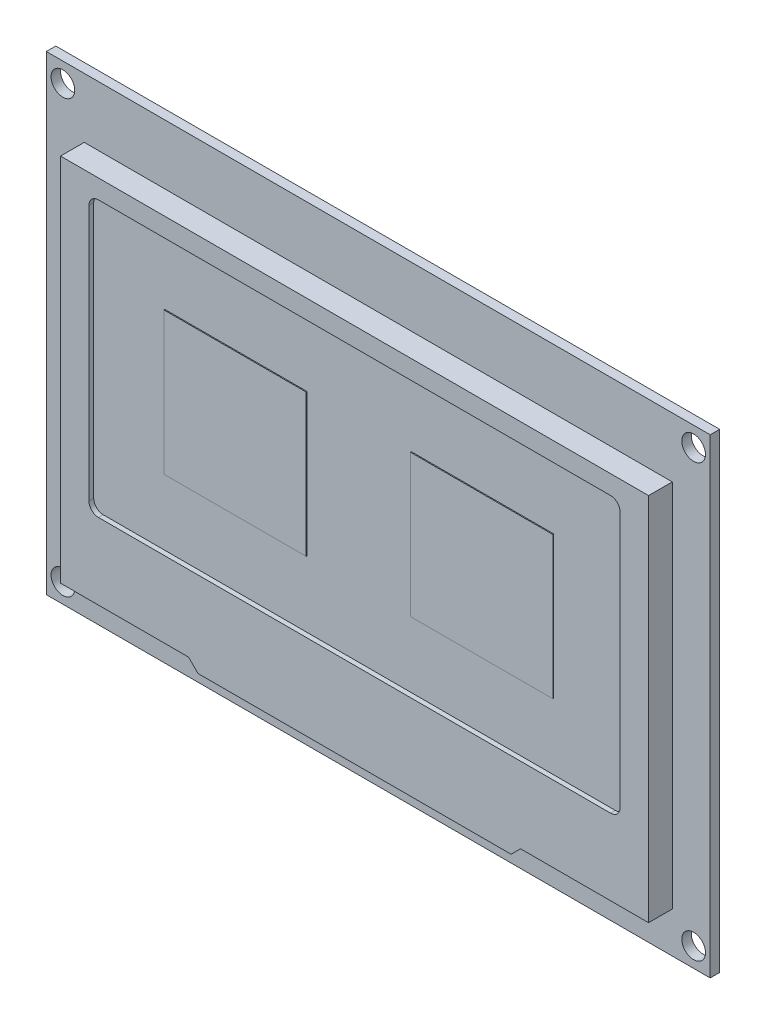
ISO-10303-21;
HEADER;
FILE_DESCRIPTION(('STEP AP214'),'2;1');
FILE_NAME('part.step','',(''),(''),'','','');
FILE_SCHEMA(('AUTOMOTIVE_DESIGN { 1 0 10303 214 1 1 1 1 }'));
ENDSEC;
DATA;
#1=APPLICATION_CONTEXT('core data for automotive mechanical design processes');
#2=APPLICATION_PROTOCOL_DEFINITION('international standard','automotive_design',2000,#1);
#3=PRODUCT_CONTEXT('',#1,'mechanical');
#4=PRODUCT('Part','Part','',(#3));
#5=PRODUCT_RELATED_PRODUCT_CATEGORY('part','',(#4));
#6=PRODUCT_DEFINITION_FORMATION('','',#4);
#7=PRODUCT_DEFINITION_CONTEXT('part definition',#1,'design');
#8=PRODUCT_DEFINITION('design','',#6,#7);
#9=PRODUCT_DEFINITION_SHAPE('','',#8);
#10=(LENGTH_UNIT() NAMED_UNIT(*) SI_UNIT(.MILLI.,.METRE.));
#11=(NAMED_UNIT(*) PLANE_ANGLE_UNIT() SI_UNIT($,.RADIAN.));
#12=(NAMED_UNIT(*) SI_UNIT($,.STERADIAN.) SOLID_ANGLE_UNIT());
#13=UNCERTAINTY_MEASURE_WITH_UNIT(LENGTH_MEASURE(1.E-05),#10,'distance_accuracy_value','');
#14=(GEOMETRIC_REPRESENTATION_CONTEXT(3) GLOBAL_UNCERTAINTY_ASSIGNED_CONTEXT((#13)) GLOBAL_UNIT_ASSIGNED_CONTEXT((#10,
#11,#12)) REPRESENTATION_CONTEXT('',''));
#15=CARTESIAN_POINT('',(0.,0.,0.));
#16=DIRECTION('',(0.,0.,1.));
#17=DIRECTION('',(1.,0.,0.));
#18=AXIS2_PLACEMENT_3D('',#15,#16,#17);
#19=CARTESIAN_POINT('',(0.,2.,3.));
#20=DIRECTION('',(0.,0.,-1.));
#21=DIRECTION('',(0.,-1.,0.));
#22=AXIS2_PLACEMENT_3D('',#19,#20,#21);
#23=PLANE('',#22);
#24=DIRECTION('',(0.,1.,0.));
#25=VECTOR('',#24,1.);
#26=CARTESIAN_POINT('',(20.5,-5.49999999999999,3.));
#27=LINE('',#26,#25);
#28=CARTESIAN_POINT('',(20.5,-5.49999999999999,3.));
#29=VERTEX_POINT('',#28);
#30=CARTESIAN_POINT('',(20.5,9.50000000000001,3.));
#31=VERTEX_POINT('',#30);
#32=EDGE_CURVE('P0_E202',#29,#31,#27,.T.);
#33=ORIENTED_EDGE('',*,*,#32,.F.);
#34=DIRECTION('',(1.,0.,0.));
#35=VECTOR('',#34,1.);
#36=CARTESIAN_POINT('',(5.5,-5.49999999999999,3.));
#37=LINE('',#36,#35);
#38=CARTESIAN_POINT('',(5.5,-5.49999999999999,3.));
#39=VERTEX_POINT('',#38);
#40=EDGE_CURVE('P0_E235',#39,#29,#37,.T.);
#41=ORIENTED_EDGE('',*,*,#40,.F.);
#42=DIRECTION('',(0.,-1.,0.));
#43=VECTOR('',#42,1.);
#44=CARTESIAN_POINT('',(5.5,-5.49999999999999,3.));
#45=LINE('',#44,#43);
#46=CARTESIAN_POINT('',(5.5,9.50000000000001,3.));
#47=VERTEX_POINT('',#46);
#48=EDGE_CURVE('P0_E247',#47,#39,#45,.T.);
#49=ORIENTED_EDGE('',*,*,#48,.F.);
#50=DIRECTION('',(-1.,0.,0.));
#51=VECTOR('',#50,1.);
#52=CARTESIAN_POINT('',(5.5,9.50000000000001,3.));
#53=LINE('',#52,#51);
#54=EDGE_CURVE('P0_E244',#31,#47,#53,.T.);
#55=ORIENTED_EDGE('',*,*,#54,.F.);
#56=EDGE_LOOP('',(#33,#41,#49,#55));
#57=FACE_BOUND('',#56,.T.);
#58=CARTESIAN_POINT('',(27.,-11.5,3.));
#59=DIRECTION('',(0.,0.,1.));
#60=DIRECTION('',(0.707106781186546,-0.707106781186549,0.));
#61=AXIS2_PLACEMENT_3D('',#58,#59,#60);
#62=CIRCLE('',#61,1.);
#63=CARTESIAN_POINT('',(27.,-12.5,3.));
#64=VERTEX_POINT('',#63);
#65=CARTESIAN_POINT('',(28.,-11.5,3.));
#66=VERTEX_POINT('',#65);
#67=EDGE_CURVE('P0_E331',#64,#66,#62,.T.);
#68=ORIENTED_EDGE('',*,*,#67,.T.);
#69=DIRECTION('',(0.,-1.,0.));
#70=VECTOR('',#69,1.);
#71=CARTESIAN_POINT('',(28.,16.5,3.));
#72=LINE('',#71,#70);
#73=CARTESIAN_POINT('',(28.,15.5,3.));
#74=VERTEX_POINT('',#73);
#75=EDGE_CURVE('P0_E352',#74,#66,#72,.T.);
#76=ORIENTED_EDGE('',*,*,#75,.F.);
#77=CARTESIAN_POINT('',(27.,15.5,3.));
#78=DIRECTION('',(0.,0.,1.));
#79=DIRECTION('',(0.707106781186546,0.707106781186549,0.));
#80=AXIS2_PLACEMENT_3D('',#77,#78,#79);
#81=CIRCLE('',#80,1.);
#82=CARTESIAN_POINT('',(27.,16.5,3.));
#83=VERTEX_POINT('',#82);
#84=EDGE_CURVE('P0_E311',#74,#83,#81,.T.);
#85=ORIENTED_EDGE('',*,*,#84,.T.);
#86=DIRECTION('',(1.,0.,0.));
#87=VECTOR('',#86,1.);
#88=CARTESIAN_POINT('',(-28.,16.5,3.));
#89=LINE('',#88,#87);
#90=CARTESIAN_POINT('',(-27.,16.5,3.));
#91=VERTEX_POINT('',#90);
#92=EDGE_CURVE('P0_E315',#91,#83,#89,.T.);
#93=ORIENTED_EDGE('',*,*,#92,.F.);
#94=CARTESIAN_POINT('',(-27.,15.5,3.));
#95=DIRECTION('',(0.,0.,1.));
#96=DIRECTION('',(-0.707106781186546,0.707106781186549,0.));
#97=AXIS2_PLACEMENT_3D('',#94,#95,#96);
#98=CIRCLE('',#97,1.);
#99=CARTESIAN_POINT('',(-28.,15.5,3.));
#100=VERTEX_POINT('',#99);
#101=EDGE_CURVE('P0_E271',#91,#100,#98,.T.);
#102=ORIENTED_EDGE('',*,*,#101,.T.);
#103=DIRECTION('',(0.,1.,0.));
#104=VECTOR('',#103,1.);
#105=CARTESIAN_POINT('',(-28.,-12.5,3.));
#106=LINE('',#105,#104);
#107=CARTESIAN_POINT('',(-28.,-11.5,3.));
#108=VERTEX_POINT('',#107);
#109=EDGE_CURVE('P0_E278',#108,#100,#106,.T.);
#110=ORIENTED_EDGE('',*,*,#109,.F.);
#111=CARTESIAN_POINT('',(-27.,-11.5,3.));
#112=DIRECTION('',(0.,0.,1.));
#113=DIRECTION('',(-0.707106781186546,-0.707106781186549,0.));
#114=AXIS2_PLACEMENT_3D('',#111,#112,#113);
#115=CIRCLE('',#114,1.);
#116=CARTESIAN_POINT('',(-27.,-12.5,3.));
#117=VERTEX_POINT('',#116);
#118=EDGE_CURVE('P0_E318',#108,#117,#115,.T.);
#119=ORIENTED_EDGE('',*,*,#118,.T.);
#120=DIRECTION('',(-1.,0.,0.));
#121=VECTOR('',#120,1.);
#122=CARTESIAN_POINT('',(28.,-12.5,3.));
#123=LINE('',#122,#121);
#124=EDGE_CURVE('P0_E300',#64,#117,#123,.T.);
#125=ORIENTED_EDGE('',*,*,#124,.F.);
#126=EDGE_LOOP('',(#68,#76,#85,#93,#102,#110,#119,#125));
#127=FACE_BOUND('',#126,.T.);
#128=DIRECTION('',(0.,1.,0.));
#129=VECTOR('',#128,1.);
#130=CARTESIAN_POINT('',(-5.5,-5.49999999999998,3.));
#131=LINE('',#130,#129);
#132=CARTESIAN_POINT('',(-5.5,-5.49999999999998,3.));
#133=VERTEX_POINT('',#132);
#134=CARTESIAN_POINT('',(-5.5,9.50000000000001,3.));
#135=VERTEX_POINT('',#134);
#136=EDGE_CURVE('P0_E196',#133,#135,#131,.T.);
#137=ORIENTED_EDGE('',*,*,#136,.F.);
#138=DIRECTION('',(1.,0.,0.));
#139=VECTOR('',#138,1.);
#140=CARTESIAN_POINT('',(-5.5,-5.49999999999998,3.));
#141=LINE('',#140,#139);
#142=CARTESIAN_POINT('',(-20.5,-5.49999999999998,3.));
#143=VERTEX_POINT('',#142);
#144=EDGE_CURVE('P0_E198',#143,#133,#141,.T.);
#145=ORIENTED_EDGE('',*,*,#144,.F.);
#146=DIRECTION('',(0.,-1.,0.));
#147=VECTOR('',#146,1.);
#148=CARTESIAN_POINT('',(-20.5,-5.49999999999998,3.));
#149=LINE('',#148,#147);
#150=CARTESIAN_POINT('',(-20.5,9.50000000000001,3.));
#151=VERTEX_POINT('',#150);
#152=EDGE_CURVE('P0_E60',#151,#143,#149,.T.);
#153=ORIENTED_EDGE('',*,*,#152,.F.);
#154=DIRECTION('',(-1.,0.,0.));
#155=VECTOR('',#154,1.);
#156=CARTESIAN_POINT('',(-5.5,9.50000000000001,3.));
#157=LINE('',#156,#155);
#158=EDGE_CURVE('P0_E55',#135,#151,#157,.T.);
#159=ORIENTED_EDGE('',*,*,#158,.F.);
#160=EDGE_LOOP('',(#137,#145,#153,#159));
#161=FACE_BOUND('',#160,.T.);
#162=ADVANCED_FACE('P0_F38',(#57,#127,#161),#23,.F.);
#163=CARTESIAN_POINT('',(0.,-1.00000000000003,1.));
#164=DIRECTION('',(0.,0.,1.));
#165=DIRECTION('',(1.,0.,0.));
#166=AXIS2_PLACEMENT_3D('',#163,#164,#165);
#167=PLANE('',#166);
#168=DIRECTION('',(0.,1.,0.));
#169=VECTOR('',#168,1.);
#170=CARTESIAN_POINT('',(-31.,8.75,1.));
#171=LINE('',#170,#169);
#172=CARTESIAN_POINT('',(-31.,-20.5,1.));
#173=VERTEX_POINT('',#172);
#174=CARTESIAN_POINT('',(-31.,18.5,1.));
#175=VERTEX_POINT('',#174);
#176=EDGE_CURVE('P0_E47',#173,#175,#171,.T.);
#177=ORIENTED_EDGE('',*,*,#176,.T.);
#178=DIRECTION('',(1.,0.,0.));
#179=VECTOR('',#178,1.);
#180=CARTESIAN_POINT('',(15.5,18.5,1.));
#181=LINE('',#180,#179);
#182=CARTESIAN_POINT('',(31.,18.5,1.));
#183=VERTEX_POINT('',#182);
#184=EDGE_CURVE('P0_E290',#175,#183,#181,.T.);
#185=ORIENTED_EDGE('',*,*,#184,.T.);
#186=DIRECTION('',(0.,-1.,0.));
#187=VECTOR('',#186,1.);
#188=CARTESIAN_POINT('',(31.,-10.75,1.));
#189=LINE('',#188,#187);
#190=CARTESIAN_POINT('',(31.,-20.5,1.));
#191=VERTEX_POINT('',#190);
#192=EDGE_CURVE('P0_E296',#183,#191,#189,.T.);
#193=ORIENTED_EDGE('',*,*,#192,.T.);
#194=DIRECTION('',(-1.,0.,0.));
#195=VECTOR('',#194,1.);
#196=CARTESIAN_POINT('',(-15.5,-20.5,1.));
#197=LINE('',#196,#195);
#198=CARTESIAN_POINT('',(17.5,-20.5,1.));
#199=VERTEX_POINT('',#198);
#200=EDGE_CURVE('P0_E285',#191,#199,#197,.T.);
#201=ORIENTED_EDGE('',*,*,#200,.T.);
#202=DIRECTION('',(0.707106781186547,0.707106781186548,0.));
#203=VECTOR('',#202,1.);
#204=CARTESIAN_POINT('',(12.5,-25.5,1.));
#205=LINE('',#204,#203);
#206=CARTESIAN_POINT('',(16.5,-21.5,1.));
#207=VERTEX_POINT('',#206);
#208=EDGE_CURVE('P0_E267',#207,#199,#205,.T.);
#209=ORIENTED_EDGE('',*,*,#208,.F.);
#210=DIRECTION('',(1.,0.,0.));
#211=VECTOR('',#210,1.);
#212=CARTESIAN_POINT('',(-8.25,-21.5,1.));
#213=LINE('',#212,#211);
#214=CARTESIAN_POINT('',(-16.5,-21.5,1.));
#215=VERTEX_POINT('',#214);
#216=EDGE_CURVE('P0_E332',#215,#207,#213,.T.);
#217=ORIENTED_EDGE('',*,*,#216,.F.);
#218=DIRECTION('',(0.707106781186548,-0.707106781186548,0.));
#219=VECTOR('',#218,1.);
#220=CARTESIAN_POINT('',(-13.,-25.,1.));
#221=LINE('',#220,#219);
#222=CARTESIAN_POINT('',(-17.5,-20.5,1.));
#223=VERTEX_POINT('',#222);
#224=EDGE_CURVE('P0_E343',#223,#215,#221,.T.);
#225=ORIENTED_EDGE('',*,*,#224,.F.);
#226=DIRECTION('',(-1.,0.,0.));
#227=VECTOR('',#226,1.);
#228=CARTESIAN_POINT('',(-15.5,-20.5,1.));
#229=LINE('',#228,#227);
#230=EDGE_CURVE('P0_E294',#223,#173,#229,.T.);
#231=ORIENTED_EDGE('',*,*,#230,.T.);
#232=EDGE_LOOP('',(#177,#185,#193,#201,#209,#217,#225,#231));
#233=FACE_BOUND('',#232,.T.);
#234=ADVANCED_FACE('P0_F432',(#233),#167,.F.);
#235=CARTESIAN_POINT('',(0.,-1.00000000000003,3.5));
#236=DIRECTION('',(0.,0.,1.));
#237=DIRECTION('',(1.,0.,0.));
#238=AXIS2_PLACEMENT_3D('',#235,#236,#237);
#239=PLANE('',#238);
#240=DIRECTION('',(0.,-1.,0.));
#241=VECTOR('',#240,1.);
#242=CARTESIAN_POINT('',(28.,7.75,3.5));
#243=LINE('',#242,#241);
#244=CARTESIAN_POINT('',(28.,15.5,3.5));
#245=VERTEX_POINT('',#244);
#246=CARTESIAN_POINT('',(28.,-11.5,3.5));
#247=VERTEX_POINT('',#246);
#248=EDGE_CURVE('P0_E303',#245,#247,#243,.T.);
#249=ORIENTED_EDGE('',*,*,#248,.T.);
#250=CARTESIAN_POINT('',(27.,-11.5,3.5));
#251=DIRECTION('',(0.,0.,1.));
#252=DIRECTION('',(0.707106781186546,-0.707106781186549,0.));
#253=AXIS2_PLACEMENT_3D('',#250,#251,#252);
#254=CIRCLE('',#253,1.);
#255=CARTESIAN_POINT('',(27.,-12.5,3.5));
#256=VERTEX_POINT('',#255);
#257=EDGE_CURVE('P0_E330',#256,#247,#254,.T.);
#258=ORIENTED_EDGE('',*,*,#257,.F.);
#259=DIRECTION('',(-1.,0.,0.));
#260=VECTOR('',#259,1.);
#261=CARTESIAN_POINT('',(14.,-12.5,3.5));
#262=LINE('',#261,#260);
#263=CARTESIAN_POINT('',(-27.,-12.5,3.5));
#264=VERTEX_POINT('',#263);
#265=EDGE_CURVE('P0_E42',#256,#264,#262,.T.);
#266=ORIENTED_EDGE('',*,*,#265,.T.);
#267=CARTESIAN_POINT('',(-27.,-11.5,3.5));
#268=DIRECTION('',(0.,0.,1.));
#269=DIRECTION('',(-0.707106781186546,-0.707106781186549,0.));
#270=AXIS2_PLACEMENT_3D('',#267,#268,#269);
#271=CIRCLE('',#270,1.);
#272=CARTESIAN_POINT('',(-28.,-11.5,3.5));
#273=VERTEX_POINT('',#272);
#274=EDGE_CURVE('P0_E366',#273,#264,#271,.T.);
#275=ORIENTED_EDGE('',*,*,#274,.F.);
#276=DIRECTION('',(0.,1.,0.));
#277=VECTOR('',#276,1.);
#278=CARTESIAN_POINT('',(-28.,-6.75,3.5));
#279=LINE('',#278,#277);
#280=CARTESIAN_POINT('',(-28.,15.5,3.5));
#281=VERTEX_POINT('',#280);
#282=EDGE_CURVE('P0_E280',#273,#281,#279,.T.);
#283=ORIENTED_EDGE('',*,*,#282,.T.);
#284=CARTESIAN_POINT('',(-27.,15.5,3.5));
#285=DIRECTION('',(0.,0.,1.));
#286=DIRECTION('',(-0.707106781186546,0.707106781186549,0.));
#287=AXIS2_PLACEMENT_3D('',#284,#285,#286);
#288=CIRCLE('',#287,1.);
#289=CARTESIAN_POINT('',(-27.,16.5,3.5));
#290=VERTEX_POINT('',#289);
#291=EDGE_CURVE('P0_E274',#290,#281,#288,.T.);
#292=ORIENTED_EDGE('',*,*,#291,.F.);
#293=DIRECTION('',(1.,0.,0.));
#294=VECTOR('',#293,1.);
#295=CARTESIAN_POINT('',(-14.,16.5,3.5));
#296=LINE('',#295,#294);
#297=CARTESIAN_POINT('',(27.,16.5,3.5));
#298=VERTEX_POINT('',#297);
#299=EDGE_CURVE('P0_E316',#290,#298,#296,.T.);
#300=ORIENTED_EDGE('',*,*,#299,.T.);
#301=CARTESIAN_POINT('',(27.,15.5,3.5));
#302=DIRECTION('',(0.,0.,1.));
#303=DIRECTION('',(0.707106781186546,0.707106781186549,0.));
#304=AXIS2_PLACEMENT_3D('',#301,#302,#303);
#305=CIRCLE('',#304,1.);
#306=EDGE_CURVE('P0_E307',#245,#298,#305,.T.);
#307=ORIENTED_EDGE('',*,*,#306,.F.);
#308=EDGE_LOOP('',(#249,#258,#266,#275,#283,#292,#300,#307));
#309=FACE_BOUND('',#308,.T.);
#310=DIRECTION('',(0.,-1.,0.));
#311=VECTOR('',#310,1.);
#312=CARTESIAN_POINT('',(-31.,8.75,3.5));
#313=LINE('',#312,#311);
#314=CARTESIAN_POINT('',(-31.,18.5,3.5));
#315=VERTEX_POINT('',#314);
#316=CARTESIAN_POINT('',(-31.,-20.5,3.5));
#317=VERTEX_POINT('',#316);
#318=EDGE_CURVE('P0_E11',#315,#317,#313,.T.);
#319=ORIENTED_EDGE('',*,*,#318,.T.);
#320=DIRECTION('',(1.,0.,0.));
#321=VECTOR('',#320,1.);
#322=CARTESIAN_POINT('',(-15.5,-20.5,3.5));
#323=LINE('',#322,#321);
#324=CARTESIAN_POINT('',(-17.5,-20.5,3.5));
#325=VERTEX_POINT('',#324);
#326=EDGE_CURVE('P0_E295',#317,#325,#323,.T.);
#327=ORIENTED_EDGE('',*,*,#326,.T.);
#328=DIRECTION('',(-0.707106781186548,0.707106781186548,0.));
#329=VECTOR('',#328,1.);
#330=CARTESIAN_POINT('',(-13.,-25.,3.5));
#331=LINE('',#330,#329);
#332=CARTESIAN_POINT('',(-16.5,-21.5,3.5));
#333=VERTEX_POINT('',#332);
#334=EDGE_CURVE('P0_E333',#333,#325,#331,.T.);
#335=ORIENTED_EDGE('',*,*,#334,.F.);
#336=DIRECTION('',(-1.,0.,0.));
#337=VECTOR('',#336,1.);
#338=CARTESIAN_POINT('',(-8.25,-21.5,3.5));
#339=LINE('',#338,#337);
#340=CARTESIAN_POINT('',(16.5,-21.5,3.5));
#341=VERTEX_POINT('',#340);
#342=EDGE_CURVE('P0_E321',#341,#333,#339,.T.);
#343=ORIENTED_EDGE('',*,*,#342,.F.);
#344=DIRECTION('',(-0.707106781186547,-0.707106781186548,0.));
#345=VECTOR('',#344,1.);
#346=CARTESIAN_POINT('',(12.5,-25.5,3.5));
#347=LINE('',#346,#345);
#348=CARTESIAN_POINT('',(17.5,-20.5,3.5));
#349=VERTEX_POINT('',#348);
#350=EDGE_CURVE('P0_E263',#349,#341,#347,.T.);
#351=ORIENTED_EDGE('',*,*,#350,.F.);
#352=DIRECTION('',(1.,0.,0.));
#353=VECTOR('',#352,1.);
#354=CARTESIAN_POINT('',(-15.5,-20.5,3.5));
#355=LINE('',#354,#353);
#356=CARTESIAN_POINT('',(31.,-20.5,3.5));
#357=VERTEX_POINT('',#356);
#358=EDGE_CURVE('P0_E284',#349,#357,#355,.T.);
#359=ORIENTED_EDGE('',*,*,#358,.T.);
#360=DIRECTION('',(0.,1.,0.));
#361=VECTOR('',#360,1.);
#362=CARTESIAN_POINT('',(31.,-10.75,3.5));
#363=LINE('',#362,#361);
#364=CARTESIAN_POINT('',(31.,18.5,3.5));
#365=VERTEX_POINT('',#364);
#366=EDGE_CURVE('P0_E298',#357,#365,#363,.T.);
#367=ORIENTED_EDGE('',*,*,#366,.T.);
#368=DIRECTION('',(-1.,0.,0.));
#369=VECTOR('',#368,1.);
#370=CARTESIAN_POINT('',(15.5,18.5,3.5));
#371=LINE('',#370,#369);
#372=EDGE_CURVE('P0_E289',#365,#315,#371,.T.);
#373=ORIENTED_EDGE('',*,*,#372,.T.);
#374=EDGE_LOOP('',(#319,#327,#335,#343,#351,#359,#367,#373));
#375=FACE_BOUND('',#374,.T.);
#376=ADVANCED_FACE('P0_F398',(#309,#375),#239,.T.);
#377=CARTESIAN_POINT('',(-31.,18.5,1.));
#378=DIRECTION('',(-1.,0.,0.));
#379=DIRECTION('',(0.,0.,1.));
#380=AXIS2_PLACEMENT_3D('',#377,#378,#379);
#381=PLANE('',#380);
#382=ORIENTED_EDGE('',*,*,#176,.F.);
#383=DIRECTION('',(0.,0.,1.));
#384=VECTOR('',#383,1.);
#385=CARTESIAN_POINT('',(-31.,-20.5,1.));
#386=LINE('',#385,#384);
#387=EDGE_CURVE('P0_E291',#173,#317,#386,.T.);
#388=ORIENTED_EDGE('',*,*,#387,.T.);
#389=ORIENTED_EDGE('',*,*,#318,.F.);
#390=DIRECTION('',(0.,0.,1.));
#391=VECTOR('',#390,1.);
#392=CARTESIAN_POINT('',(-31.,18.5,1.));
#393=LINE('',#392,#391);
#394=EDGE_CURVE('P0_E286',#175,#315,#393,.T.);
#395=ORIENTED_EDGE('',*,*,#394,.F.);
#396=EDGE_LOOP('',(#382,#388,#389,#395));
#397=FACE_BOUND('',#396,.T.);
#398=ADVANCED_FACE('P0_F449',(#397),#381,.T.);
#399=CARTESIAN_POINT('',(31.,-20.5,1.));
#400=DIRECTION('',(1.,0.,0.));
#401=DIRECTION('',(0.,1.,0.));
#402=AXIS2_PLACEMENT_3D('',#399,#400,#401);
#403=PLANE('',#402);
#404=ORIENTED_EDGE('',*,*,#192,.F.);
#405=DIRECTION('',(0.,0.,1.));
#406=VECTOR('',#405,1.);
#407=CARTESIAN_POINT('',(31.,18.5,1.));
#408=LINE('',#407,#406);
#409=EDGE_CURVE('P0_E299',#183,#365,#408,.T.);
#410=ORIENTED_EDGE('',*,*,#409,.T.);
#411=ORIENTED_EDGE('',*,*,#366,.F.);
#412=DIRECTION('',(0.,0.,1.));
#413=VECTOR('',#412,1.);
#414=CARTESIAN_POINT('',(31.,-20.5,1.));
#415=LINE('',#414,#413);
#416=EDGE_CURVE('P0_E281',#191,#357,#415,.T.);
#417=ORIENTED_EDGE('',*,*,#416,.F.);
#418=EDGE_LOOP('',(#404,#410,#411,#417));
#419=FACE_BOUND('',#418,.T.);
#420=ADVANCED_FACE('P0_F447',(#419),#403,.T.);
#421=CARTESIAN_POINT('',(31.,18.5,1.));
#422=DIRECTION('',(0.,1.,0.));
#423=DIRECTION('',(1.,0.,0.));
#424=AXIS2_PLACEMENT_3D('',#421,#422,#423);
#425=PLANE('',#424);
#426=ORIENTED_EDGE('',*,*,#184,.F.);
#427=ORIENTED_EDGE('',*,*,#394,.T.);
#428=ORIENTED_EDGE('',*,*,#372,.F.);
#429=ORIENTED_EDGE('',*,*,#409,.F.);
#430=EDGE_LOOP('',(#426,#427,#428,#429));
#431=FACE_BOUND('',#430,.T.);
#432=ADVANCED_FACE('P0_F427',(#431),#425,.T.);
#433=CARTESIAN_POINT('',(-28.,-12.5,3.5));
#434=DIRECTION('',(-1.,0.,0.));
#435=DIRECTION('',(0.,0.,1.));
#436=AXIS2_PLACEMENT_3D('',#433,#434,#435);
#437=PLANE('',#436);
#438=DIRECTION('',(0.,0.,1.));
#439=VECTOR('',#438,1.);
#440=CARTESIAN_POINT('',(-28.,-11.5,3.5));
#441=LINE('',#440,#439);
#442=EDGE_CURVE('P0_E340',#108,#273,#441,.T.);
#443=ORIENTED_EDGE('',*,*,#442,.F.);
#444=ORIENTED_EDGE('',*,*,#109,.T.);
#445=DIRECTION('',(0.,0.,-1.));
#446=VECTOR('',#445,1.);
#447=CARTESIAN_POINT('',(-28.,15.5,3.5));
#448=LINE('',#447,#446);
#449=EDGE_CURVE('P0_E275',#281,#100,#448,.T.);
#450=ORIENTED_EDGE('',*,*,#449,.F.);
#451=ORIENTED_EDGE('',*,*,#282,.F.);
#452=EDGE_LOOP('',(#443,#444,#450,#451));
#453=FACE_BOUND('',#452,.T.);
#454=ADVANCED_FACE('P0_F396',(#453),#437,.F.);
#455=CARTESIAN_POINT('',(-27.,15.5,3.5));
#456=DIRECTION('',(0.,0.,-1.));
#457=DIRECTION('',(-0.707106781186546,0.707106781186549,0.));
#458=AXIS2_PLACEMENT_3D('',#455,#456,#457);
#459=CYLINDRICAL_SURFACE('',#458,1.);
#460=ORIENTED_EDGE('',*,*,#101,.F.);
#461=DIRECTION('',(0.,0.,1.));
#462=VECTOR('',#461,1.);
#463=CARTESIAN_POINT('',(-27.,16.5,3.5));
#464=LINE('',#463,#462);
#465=EDGE_CURVE('P0_E312',#91,#290,#464,.T.);
#466=ORIENTED_EDGE('',*,*,#465,.T.);
#467=ORIENTED_EDGE('',*,*,#291,.T.);
#468=ORIENTED_EDGE('',*,*,#449,.T.);
#469=EDGE_LOOP('',(#460,#466,#467,#468));
#470=FACE_BOUND('',#469,.T.);
#471=ADVANCED_FACE('P0_F419',(#470),#459,.F.);
#472=CARTESIAN_POINT('',(28.,-12.5,3.5));
#473=DIRECTION('',(0.,-1.,0.));
#474=DIRECTION('',(0.,0.,-1.));
#475=AXIS2_PLACEMENT_3D('',#472,#473,#474);
#476=PLANE('',#475);
#477=DIRECTION('',(0.,0.,1.));
#478=VECTOR('',#477,1.);
#479=CARTESIAN_POINT('',(27.,-12.5,3.5));
#480=LINE('',#479,#478);
#481=EDGE_CURVE('P0_E327',#64,#256,#480,.T.);
#482=ORIENTED_EDGE('',*,*,#481,.F.);
#483=ORIENTED_EDGE('',*,*,#124,.T.);
#484=DIRECTION('',(0.,0.,-1.));
#485=VECTOR('',#484,1.);
#486=CARTESIAN_POINT('',(-27.,-12.5,3.5));
#487=LINE('',#486,#485);
#488=EDGE_CURVE('P0_E302',#264,#117,#487,.T.);
#489=ORIENTED_EDGE('',*,*,#488,.F.);
#490=ORIENTED_EDGE('',*,*,#265,.F.);
#491=EDGE_LOOP('',(#482,#483,#489,#490));
#492=FACE_BOUND('',#491,.T.);
#493=ADVANCED_FACE('P0_F401',(#492),#476,.F.);
#494=CARTESIAN_POINT('',(-27.,-11.5,3.5));
#495=DIRECTION('',(0.,0.,-1.));
#496=DIRECTION('',(-0.707106781186546,-0.707106781186549,0.));
#497=AXIS2_PLACEMENT_3D('',#494,#495,#496);
#498=CYLINDRICAL_SURFACE('',#497,1.);
#499=ORIENTED_EDGE('',*,*,#118,.F.);
#500=ORIENTED_EDGE('',*,*,#442,.T.);
#501=ORIENTED_EDGE('',*,*,#274,.T.);
#502=ORIENTED_EDGE('',*,*,#488,.T.);
#503=EDGE_LOOP('',(#499,#500,#501,#502));
#504=FACE_BOUND('',#503,.T.);
#505=ADVANCED_FACE('P0_F387',(#504),#498,.F.);
#506=CARTESIAN_POINT('',(-28.,16.5,3.5));
#507=DIRECTION('',(0.,1.,0.));
#508=DIRECTION('',(1.,0.,0.));
#509=AXIS2_PLACEMENT_3D('',#506,#507,#508);
#510=PLANE('',#509);
#511=DIRECTION('',(0.,0.,-1.));
#512=VECTOR('',#511,1.);
#513=CARTESIAN_POINT('',(27.,16.5,3.5));
#514=LINE('',#513,#512);
#515=EDGE_CURVE('P0_E310',#298,#83,#514,.T.);
#516=ORIENTED_EDGE('',*,*,#515,.F.);
#517=ORIENTED_EDGE('',*,*,#299,.F.);
#518=ORIENTED_EDGE('',*,*,#465,.F.);
#519=ORIENTED_EDGE('',*,*,#92,.T.);
#520=EDGE_LOOP('',(#516,#517,#518,#519));
#521=FACE_BOUND('',#520,.T.);
#522=ADVANCED_FACE('P0_F416',(#521),#510,.F.);
#523=CARTESIAN_POINT('',(27.,15.5,3.5));
#524=DIRECTION('',(0.,0.,-1.));
#525=DIRECTION('',(0.707106781186546,0.707106781186549,0.));
#526=AXIS2_PLACEMENT_3D('',#523,#524,#525);
#527=CYLINDRICAL_SURFACE('',#526,1.);
#528=ORIENTED_EDGE('',*,*,#84,.F.);
#529=DIRECTION('',(0.,0.,1.));
#530=VECTOR('',#529,1.);
#531=CARTESIAN_POINT('',(28.,15.5,3.5));
#532=LINE('',#531,#530);
#533=EDGE_CURVE('P0_E305',#74,#245,#532,.T.);
#534=ORIENTED_EDGE('',*,*,#533,.T.);
#535=ORIENTED_EDGE('',*,*,#306,.T.);
#536=ORIENTED_EDGE('',*,*,#515,.T.);
#537=EDGE_LOOP('',(#528,#534,#535,#536));
#538=FACE_BOUND('',#537,.T.);
#539=ADVANCED_FACE('P0_F412',(#538),#527,.F.);
#540=CARTESIAN_POINT('',(28.,16.5,3.5));
#541=DIRECTION('',(1.,0.,0.));
#542=DIRECTION('',(0.,1.,0.));
#543=AXIS2_PLACEMENT_3D('',#540,#541,#542);
#544=PLANE('',#543);
#545=DIRECTION('',(0.,0.,-1.));
#546=VECTOR('',#545,1.);
#547=CARTESIAN_POINT('',(28.,-11.5,3.5));
#548=LINE('',#547,#546);
#549=EDGE_CURVE('P0_E306',#247,#66,#548,.T.);
#550=ORIENTED_EDGE('',*,*,#549,.F.);
#551=ORIENTED_EDGE('',*,*,#248,.F.);
#552=ORIENTED_EDGE('',*,*,#533,.F.);
#553=ORIENTED_EDGE('',*,*,#75,.T.);
#554=EDGE_LOOP('',(#550,#551,#552,#553));
#555=FACE_BOUND('',#554,.T.);
#556=ADVANCED_FACE('P0_F410',(#555),#544,.F.);
#557=CARTESIAN_POINT('',(27.,-11.5,3.5));
#558=DIRECTION('',(0.,0.,-1.));
#559=DIRECTION('',(0.707106781186546,-0.707106781186549,0.));
#560=AXIS2_PLACEMENT_3D('',#557,#558,#559);
#561=CYLINDRICAL_SURFACE('',#560,1.);
#562=ORIENTED_EDGE('',*,*,#67,.F.);
#563=ORIENTED_EDGE('',*,*,#481,.T.);
#564=ORIENTED_EDGE('',*,*,#257,.T.);
#565=ORIENTED_EDGE('',*,*,#549,.T.);
#566=EDGE_LOOP('',(#562,#563,#564,#565));
#567=FACE_BOUND('',#566,.T.);
#568=ADVANCED_FACE('P0_F404',(#567),#561,.F.);
#569=CARTESIAN_POINT('',(-31.,-20.5,1.));
#570=DIRECTION('',(0.,-1.,0.));
#571=DIRECTION('',(0.,0.,-1.));
#572=AXIS2_PLACEMENT_3D('',#569,#570,#571);
#573=PLANE('',#572);
#574=DIRECTION('',(0.,0.,-1.));
#575=VECTOR('',#574,1.);
#576=CARTESIAN_POINT('',(17.5,-20.5,1.));
#577=LINE('',#576,#575);
#578=EDGE_CURVE('P0_E270',#349,#199,#577,.T.);
#579=ORIENTED_EDGE('',*,*,#578,.T.);
#580=ORIENTED_EDGE('',*,*,#200,.F.);
#581=ORIENTED_EDGE('',*,*,#416,.T.);
#582=ORIENTED_EDGE('',*,*,#358,.F.);
#583=EDGE_LOOP('',(#579,#580,#581,#582));
#584=FACE_BOUND('',#583,.T.);
#585=ADVANCED_FACE('P0_F445',(#584),#573,.T.);
#586=CARTESIAN_POINT('',(-31.,-20.5,1.));
#587=DIRECTION('',(0.,-1.,0.));
#588=DIRECTION('',(0.,0.,-1.));
#589=AXIS2_PLACEMENT_3D('',#586,#587,#588);
#590=PLANE('',#589);
#591=DIRECTION('',(0.,0.,1.));
#592=VECTOR('',#591,1.);
#593=CARTESIAN_POINT('',(-17.5,-20.5,1.));
#594=LINE('',#593,#592);
#595=EDGE_CURVE('P0_E345',#223,#325,#594,.T.);
#596=ORIENTED_EDGE('',*,*,#595,.T.);
#597=ORIENTED_EDGE('',*,*,#326,.F.);
#598=ORIENTED_EDGE('',*,*,#387,.F.);
#599=ORIENTED_EDGE('',*,*,#230,.F.);
#600=EDGE_LOOP('',(#596,#597,#598,#599));
#601=FACE_BOUND('',#600,.T.);
#602=ADVANCED_FACE('P0_F40',(#601),#590,.T.);
#603=CARTESIAN_POINT('',(-17.5,-20.5,1.));
#604=DIRECTION('',(-0.707106781186548,-0.707106781186548,0.));
#605=DIRECTION('',(-0.707106781186548,0.707106781186548,0.));
#606=AXIS2_PLACEMENT_3D('',#603,#604,#605);
#607=PLANE('',#606);
#608=ORIENTED_EDGE('',*,*,#334,.T.);
#609=ORIENTED_EDGE('',*,*,#595,.F.);
#610=ORIENTED_EDGE('',*,*,#224,.T.);
#611=DIRECTION('',(0.,0.,1.));
#612=VECTOR('',#611,1.);
#613=CARTESIAN_POINT('',(-16.5,-21.5,1.));
#614=LINE('',#613,#612);
#615=EDGE_CURVE('P0_E324',#215,#333,#614,.T.);
#616=ORIENTED_EDGE('',*,*,#615,.T.);
#617=EDGE_LOOP('',(#608,#609,#610,#616));
#618=FACE_BOUND('',#617,.T.);
#619=ADVANCED_FACE('P0_F479',(#618),#607,.T.);
#620=CARTESIAN_POINT('',(-16.5,-21.5,1.));
#621=DIRECTION('',(0.,-1.,0.));
#622=DIRECTION('',(0.,0.,-1.));
#623=AXIS2_PLACEMENT_3D('',#620,#621,#622);
#624=PLANE('',#623);
#625=ORIENTED_EDGE('',*,*,#342,.T.);
#626=ORIENTED_EDGE('',*,*,#615,.F.);
#627=ORIENTED_EDGE('',*,*,#216,.T.);
#628=DIRECTION('',(0.,0.,1.));
#629=VECTOR('',#628,1.);
#630=CARTESIAN_POINT('',(16.5,-21.5,1.));
#631=LINE('',#630,#629);
#632=EDGE_CURVE('P0_E266',#207,#341,#631,.T.);
#633=ORIENTED_EDGE('',*,*,#632,.T.);
#634=EDGE_LOOP('',(#625,#626,#627,#633));
#635=FACE_BOUND('',#634,.T.);
#636=ADVANCED_FACE('P0_F477',(#635),#624,.T.);
#637=CARTESIAN_POINT('',(16.5,-21.5,1.));
#638=DIRECTION('',(0.707106781186548,-0.707106781186547,0.));
#639=DIRECTION('',(0.,0.,-1.));
#640=AXIS2_PLACEMENT_3D('',#637,#638,#639);
#641=PLANE('',#640);
#642=ORIENTED_EDGE('',*,*,#350,.T.);
#643=ORIENTED_EDGE('',*,*,#632,.F.);
#644=ORIENTED_EDGE('',*,*,#208,.T.);
#645=ORIENTED_EDGE('',*,*,#578,.F.);
#646=EDGE_LOOP('',(#642,#643,#644,#645));
#647=FACE_BOUND('',#646,.T.);
#648=ADVANCED_FACE('P0_F475',(#647),#641,.T.);
#649=CARTESIAN_POINT('',(20.5,-5.49999999999999,3.1));
#650=DIRECTION('',(-1.,0.,0.));
#651=DIRECTION('',(0.,0.,1.));
#652=AXIS2_PLACEMENT_3D('',#649,#650,#651);
#653=PLANE('',#652);
#654=ORIENTED_EDGE('',*,*,#32,.T.);
#655=DIRECTION('',(0.,0.,-1.));
#656=VECTOR('',#655,1.);
#657=CARTESIAN_POINT('',(20.5,9.50000000000001,3.1));
#658=LINE('',#657,#656);
#659=CARTESIAN_POINT('',(20.5,9.50000000000001,3.1));
#660=VERTEX_POINT('',#659);
#661=EDGE_CURVE('P0_E260',#660,#31,#658,.T.);
#662=ORIENTED_EDGE('',*,*,#661,.F.);
#663=DIRECTION('',(0.,1.,0.));
#664=VECTOR('',#663,1.);
#665=CARTESIAN_POINT('',(20.5,-5.49999999999999,3.1));
#666=LINE('',#665,#664);
#667=CARTESIAN_POINT('',(20.5,-5.49999999999999,3.1));
#668=VERTEX_POINT('',#667);
#669=EDGE_CURVE('P0_E231',#668,#660,#666,.T.);
#670=ORIENTED_EDGE('',*,*,#669,.F.);
#671=DIRECTION('',(0.,0.,-1.));
#672=VECTOR('',#671,1.);
#673=CARTESIAN_POINT('',(20.5,-5.49999999999999,3.1));
#674=LINE('',#673,#672);
#675=EDGE_CURVE('P0_E241',#668,#29,#674,.T.);
#676=ORIENTED_EDGE('',*,*,#675,.T.);
#677=EDGE_LOOP('',(#654,#662,#670,#676));
#678=FACE_BOUND('',#677,.T.);
#679=ADVANCED_FACE('P0_F493',(#678),#653,.F.);
#680=CARTESIAN_POINT('',(5.5,9.50000000000001,3.1));
#681=DIRECTION('',(0.,-1.,0.));
#682=DIRECTION('',(0.,0.,-1.));
#683=AXIS2_PLACEMENT_3D('',#680,#681,#682);
#684=PLANE('',#683);
#685=ORIENTED_EDGE('',*,*,#54,.T.);
#686=DIRECTION('',(0.,0.,-1.));
#687=VECTOR('',#686,1.);
#688=CARTESIAN_POINT('',(5.5,9.50000000000001,3.1));
#689=LINE('',#688,#687);
#690=CARTESIAN_POINT('',(5.5,9.50000000000001,3.1));
#691=VERTEX_POINT('',#690);
#692=EDGE_CURVE('P0_E257',#691,#47,#689,.T.);
#693=ORIENTED_EDGE('',*,*,#692,.F.);
#694=DIRECTION('',(-1.,0.,0.));
#695=VECTOR('',#694,1.);
#696=CARTESIAN_POINT('',(5.5,9.50000000000001,3.1));
#697=LINE('',#696,#695);
#698=EDGE_CURVE('P0_E234',#660,#691,#697,.T.);
#699=ORIENTED_EDGE('',*,*,#698,.F.);
#700=ORIENTED_EDGE('',*,*,#661,.T.);
#701=EDGE_LOOP('',(#685,#693,#699,#700));
#702=FACE_BOUND('',#701,.T.);
#703=ADVANCED_FACE('P0_F498',(#702),#684,.F.);
#704=CARTESIAN_POINT('',(5.5,-5.49999999999999,3.1));
#705=DIRECTION('',(1.,0.,0.));
#706=DIRECTION('',(0.,0.,-1.));
#707=AXIS2_PLACEMENT_3D('',#704,#705,#706);
#708=PLANE('',#707);
#709=ORIENTED_EDGE('',*,*,#48,.T.);
#710=DIRECTION('',(0.,0.,-1.));
#711=VECTOR('',#710,1.);
#712=CARTESIAN_POINT('',(5.5,-5.49999999999999,3.1));
#713=LINE('',#712,#711);
#714=CARTESIAN_POINT('',(5.5,-5.49999999999999,3.1));
#715=VERTEX_POINT('',#714);
#716=EDGE_CURVE('P0_E254',#715,#39,#713,.T.);
#717=ORIENTED_EDGE('',*,*,#716,.F.);
#718=DIRECTION('',(0.,-1.,0.));
#719=VECTOR('',#718,1.);
#720=CARTESIAN_POINT('',(5.5,-5.49999999999999,3.1));
#721=LINE('',#720,#719);
#722=EDGE_CURVE('P0_E237',#691,#715,#721,.T.);
#723=ORIENTED_EDGE('',*,*,#722,.F.);
#724=ORIENTED_EDGE('',*,*,#692,.T.);
#725=EDGE_LOOP('',(#709,#717,#723,#724));
#726=FACE_BOUND('',#725,.T.);
#727=ADVANCED_FACE('P0_F614',(#726),#708,.F.);
#728=CARTESIAN_POINT('',(5.5,-5.49999999999999,3.1));
#729=DIRECTION('',(0.,1.,0.));
#730=DIRECTION('',(0.,0.,1.));
#731=AXIS2_PLACEMENT_3D('',#728,#729,#730);
#732=PLANE('',#731);
#733=ORIENTED_EDGE('',*,*,#40,.T.);
#734=ORIENTED_EDGE('',*,*,#675,.F.);
#735=DIRECTION('',(1.,0.,0.));
#736=VECTOR('',#735,1.);
#737=CARTESIAN_POINT('',(5.5,-5.49999999999999,3.1));
#738=LINE('',#737,#736);
#739=EDGE_CURVE('P0_E239',#715,#668,#738,.T.);
#740=ORIENTED_EDGE('',*,*,#739,.F.);
#741=ORIENTED_EDGE('',*,*,#716,.T.);
#742=EDGE_LOOP('',(#733,#734,#740,#741));
#743=FACE_BOUND('',#742,.T.);
#744=ADVANCED_FACE('P0_F625',(#743),#732,.F.);
#745=CARTESIAN_POINT('',(0.,0.,3.1));
#746=DIRECTION('',(0.,0.,-1.));
#747=DIRECTION('',(-1.,0.,0.));
#748=AXIS2_PLACEMENT_3D('',#745,#746,#747);
#749=PLANE('',#748);
#750=ORIENTED_EDGE('',*,*,#669,.T.);
#751=ORIENTED_EDGE('',*,*,#698,.T.);
#752=ORIENTED_EDGE('',*,*,#722,.T.);
#753=ORIENTED_EDGE('',*,*,#739,.T.);
#754=EDGE_LOOP('',(#750,#751,#752,#753));
#755=FACE_BOUND('',#754,.T.);
#756=ADVANCED_FACE('P0_F636',(#755),#749,.F.);
#757=CARTESIAN_POINT('',(-5.5,-5.49999999999998,3.1));
#758=DIRECTION('',(-1.,0.,0.));
#759=DIRECTION('',(0.,0.,1.));
#760=AXIS2_PLACEMENT_3D('',#757,#758,#759);
#761=PLANE('',#760);
#762=ORIENTED_EDGE('',*,*,#136,.T.);
#763=DIRECTION('',(0.,0.,-1.));
#764=VECTOR('',#763,1.);
#765=CARTESIAN_POINT('',(-5.5,9.50000000000001,3.1));
#766=LINE('',#765,#764);
#767=CARTESIAN_POINT('',(-5.5,9.50000000000001,3.1));
#768=VERTEX_POINT('',#767);
#769=EDGE_CURVE('P0_E714',#768,#135,#766,.T.);
#770=ORIENTED_EDGE('',*,*,#769,.F.);
#771=DIRECTION('',(0.,1.,0.));
#772=VECTOR('',#771,1.);
#773=CARTESIAN_POINT('',(-5.5,-5.49999999999998,3.1));
#774=LINE('',#773,#772);
#775=CARTESIAN_POINT('',(-5.5,-5.49999999999998,3.1));
#776=VERTEX_POINT('',#775);
#777=EDGE_CURVE('P0_E213',#776,#768,#774,.T.);
#778=ORIENTED_EDGE('',*,*,#777,.F.);
#779=DIRECTION('',(0.,0.,-1.));
#780=VECTOR('',#779,1.);
#781=CARTESIAN_POINT('',(-5.5,-5.49999999999998,3.1));
#782=LINE('',#781,#780);
#783=EDGE_CURVE('P0_E209',#776,#133,#782,.T.);
#784=ORIENTED_EDGE('',*,*,#783,.T.);
#785=EDGE_LOOP('',(#762,#770,#778,#784));
#786=FACE_BOUND('',#785,.T.);
#787=ADVANCED_FACE('P0_F215',(#786),#761,.F.);
#788=CARTESIAN_POINT('',(-5.5,9.50000000000001,3.1));
#789=DIRECTION('',(0.,-1.,0.));
#790=DIRECTION('',(0.,0.,-1.));
#791=AXIS2_PLACEMENT_3D('',#788,#789,#790);
#792=PLANE('',#791);
#793=ORIENTED_EDGE('',*,*,#158,.T.);
#794=DIRECTION('',(0.,0.,-1.));
#795=VECTOR('',#794,1.);
#796=CARTESIAN_POINT('',(-20.5,9.50000000000001,3.1));
#797=LINE('',#796,#795);
#798=CARTESIAN_POINT('',(-20.5,9.50000000000001,3.1));
#799=VERTEX_POINT('',#798);
#800=EDGE_CURVE('P0_E221',#799,#151,#797,.T.);
#801=ORIENTED_EDGE('',*,*,#800,.F.);
#802=DIRECTION('',(-1.,0.,0.));
#803=VECTOR('',#802,1.);
#804=CARTESIAN_POINT('',(-5.5,9.50000000000001,3.1));
#805=LINE('',#804,#803);
#806=EDGE_CURVE('P0_E228',#768,#799,#805,.T.);
#807=ORIENTED_EDGE('',*,*,#806,.F.);
#808=ORIENTED_EDGE('',*,*,#769,.T.);
#809=EDGE_LOOP('',(#793,#801,#807,#808));
#810=FACE_BOUND('',#809,.T.);
#811=ADVANCED_FACE('P0_F657',(#810),#792,.F.);
#812=CARTESIAN_POINT('',(-20.5,-5.49999999999998,3.1));
#813=DIRECTION('',(1.,0.,0.));
#814=DIRECTION('',(0.,0.,-1.));
#815=AXIS2_PLACEMENT_3D('',#812,#813,#814);
#816=PLANE('',#815);
#817=ORIENTED_EDGE('',*,*,#152,.T.);
#818=DIRECTION('',(0.,0.,-1.));
#819=VECTOR('',#818,1.);
#820=CARTESIAN_POINT('',(-20.5,-5.49999999999998,3.1));
#821=LINE('',#820,#819);
#822=CARTESIAN_POINT('',(-20.5,-5.49999999999998,3.1));
#823=VERTEX_POINT('',#822);
#824=EDGE_CURVE('P0_E212',#823,#143,#821,.T.);
#825=ORIENTED_EDGE('',*,*,#824,.F.);
#826=DIRECTION('',(0.,-1.,0.));
#827=VECTOR('',#826,1.);
#828=CARTESIAN_POINT('',(-20.5,-5.49999999999998,3.1));
#829=LINE('',#828,#827);
#830=EDGE_CURVE('P0_E219',#799,#823,#829,.T.);
#831=ORIENTED_EDGE('',*,*,#830,.F.);
#832=ORIENTED_EDGE('',*,*,#800,.T.);
#833=EDGE_LOOP('',(#817,#825,#831,#832));
#834=FACE_BOUND('',#833,.T.);
#835=ADVANCED_FACE('P0_F667',(#834),#816,.F.);
#836=CARTESIAN_POINT('',(-5.5,-5.49999999999998,3.1));
#837=DIRECTION('',(0.,1.,0.));
#838=DIRECTION('',(0.,0.,1.));
#839=AXIS2_PLACEMENT_3D('',#836,#837,#838);
#840=PLANE('',#839);
#841=ORIENTED_EDGE('',*,*,#144,.T.);
#842=ORIENTED_EDGE('',*,*,#783,.F.);
#843=DIRECTION('',(1.,0.,0.));
#844=VECTOR('',#843,1.);
#845=CARTESIAN_POINT('',(-5.5,-5.49999999999998,3.1));
#846=LINE('',#845,#844);
#847=EDGE_CURVE('P0_E217',#823,#776,#846,.T.);
#848=ORIENTED_EDGE('',*,*,#847,.F.);
#849=ORIENTED_EDGE('',*,*,#824,.T.);
#850=EDGE_LOOP('',(#841,#842,#848,#849));
#851=FACE_BOUND('',#850,.T.);
#852=ADVANCED_FACE('P0_F207',(#851),#840,.F.);
#853=CARTESIAN_POINT('',(0.,0.,3.1));
#854=DIRECTION('',(0.,0.,1.));
#855=DIRECTION('',(1.,0.,0.));
#856=AXIS2_PLACEMENT_3D('',#853,#854,#855);
#857=PLANE('',#856);
#858=ORIENTED_EDGE('',*,*,#777,.T.);
#859=ORIENTED_EDGE('',*,*,#806,.T.);
#860=ORIENTED_EDGE('',*,*,#830,.T.);
#861=ORIENTED_EDGE('',*,*,#847,.T.);
#862=EDGE_LOOP('',(#858,#859,#860,#861));
#863=FACE_BOUND('',#862,.T.);
#864=ADVANCED_FACE('P0_F688',(#863),#857,.T.);
#865=CLOSED_SHELL('',(#162,#234,#376,#398,#420,#432,#454,#471,#493,#505,#522,#539,#556,#568,
#585,#602,#619,#636,#648,#679,#703,#727,#744,#756,#787,#811,#835,#852,#864));
#866=MANIFOLD_SOLID_BREP('P0_B2',#865);
#867=CARTESIAN_POINT('',(0.,0.,0.));
#868=DIRECTION('',(0.,0.,1.));
#869=DIRECTION('',(1.,0.,0.));
#870=AXIS2_PLACEMENT_3D('',#867,#868,#869);
#871=PLANE('',#870);
#872=CARTESIAN_POINT('',(33.25,22.75,0.));
#873=DIRECTION('',(0.,0.,1.));
#874=DIRECTION('',(1.,0.,0.));
#875=AXIS2_PLACEMENT_3D('',#872,#873,#874);
#876=CIRCLE('',#875,1.25);
#877=CARTESIAN_POINT('',(32.,22.75,0.));
#878=VERTEX_POINT('',#877);
#879=EDGE_CURVE('P1_E159',#878,#878,#876,.T.);
#880=ORIENTED_EDGE('',*,*,#879,.T.);
#881=EDGE_LOOP('',(#880));
#882=FACE_BOUND('',#881,.T.);
#883=CARTESIAN_POINT('',(-33.25,22.75,0.));
#884=DIRECTION('',(0.,0.,1.));
#885=DIRECTION('',(1.,0.,0.));
#886=AXIS2_PLACEMENT_3D('',#883,#884,#885);
#887=CIRCLE('',#886,1.25);
#888=CARTESIAN_POINT('',(-34.5,22.75,0.));
#889=VERTEX_POINT('',#888);
#890=EDGE_CURVE('P1_E123',#889,#889,#887,.T.);
#891=ORIENTED_EDGE('',*,*,#890,.T.);
#892=EDGE_LOOP('',(#891));
#893=FACE_BOUND('',#892,.T.);
#894=CARTESIAN_POINT('',(33.25,-22.75,0.));
#895=DIRECTION('',(0.,0.,1.));
#896=DIRECTION('',(1.,0.,0.));
#897=AXIS2_PLACEMENT_3D('',#894,#895,#896);
#898=CIRCLE('',#897,1.25);
#899=CARTESIAN_POINT('',(32.,-22.75,0.));
#900=VERTEX_POINT('',#899);
#901=EDGE_CURVE('P1_E116',#900,#900,#898,.T.);
#902=ORIENTED_EDGE('',*,*,#901,.T.);
#903=EDGE_LOOP('',(#902));
#904=FACE_BOUND('',#903,.T.);
#905=CARTESIAN_POINT('',(-33.25,-22.75,0.));
#906=DIRECTION('',(0.,0.,1.));
#907=DIRECTION('',(1.,0.,0.));
#908=AXIS2_PLACEMENT_3D('',#905,#906,#907);
#909=CIRCLE('',#908,1.25);
#910=CARTESIAN_POINT('',(-34.5,-22.75,0.));
#911=VERTEX_POINT('',#910);
#912=EDGE_CURVE('P1_E143',#911,#911,#909,.T.);
#913=ORIENTED_EDGE('',*,*,#912,.T.);
#914=EDGE_LOOP('',(#913));
#915=FACE_BOUND('',#914,.T.);
#916=DIRECTION('',(-1.,0.,0.));
#917=VECTOR('',#916,1.);
#918=CARTESIAN_POINT('',(35.,-24.8,0.));
#919=LINE('',#918,#917);
#920=CARTESIAN_POINT('',(35.,-24.8,0.));
#921=VERTEX_POINT('',#920);
#922=CARTESIAN_POINT('',(-35.,-24.8,0.));
#923=VERTEX_POINT('',#922);
#924=EDGE_CURVE('P1_E27',#921,#923,#919,.T.);
#925=ORIENTED_EDGE('',*,*,#924,.T.);
#926=DIRECTION('',(0.,1.,0.));
#927=VECTOR('',#926,1.);
#928=CARTESIAN_POINT('',(-35.,-24.8,0.));
#929=LINE('',#928,#927);
#930=CARTESIAN_POINT('',(-35.,24.8,0.));
#931=VERTEX_POINT('',#930);
#932=EDGE_CURVE('P1_E155',#923,#931,#929,.T.);
#933=ORIENTED_EDGE('',*,*,#932,.T.);
#934=DIRECTION('',(1.,0.,0.));
#935=VECTOR('',#934,1.);
#936=CARTESIAN_POINT('',(-35.,24.8,0.));
#937=LINE('',#936,#935);
#938=CARTESIAN_POINT('',(35.,24.8,0.));
#939=VERTEX_POINT('',#938);
#940=EDGE_CURVE('P1_E106',#931,#939,#937,.T.);
#941=ORIENTED_EDGE('',*,*,#940,.T.);
#942=DIRECTION('',(0.,-1.,0.));
#943=VECTOR('',#942,1.);
#944=CARTESIAN_POINT('',(35.,24.8,0.));
#945=LINE('',#944,#943);
#946=EDGE_CURVE('P1_E93',#939,#921,#945,.T.);
#947=ORIENTED_EDGE('',*,*,#946,.T.);
#948=EDGE_LOOP('',(#925,#933,#941,#947));
#949=FACE_BOUND('',#948,.T.);
#950=ADVANCED_FACE('P1_F16',(#882,#893,#904,#915,#949),#871,.F.);
#951=CARTESIAN_POINT('',(0.,0.,1.));
#952=DIRECTION('',(0.,0.,1.));
#953=DIRECTION('',(1.,0.,0.));
#954=AXIS2_PLACEMENT_3D('',#951,#952,#953);
#955=PLANE('',#954);
#956=CARTESIAN_POINT('',(33.25,22.75,1.));
#957=DIRECTION('',(0.,0.,-1.));
#958=DIRECTION('',(1.,0.,0.));
#959=AXIS2_PLACEMENT_3D('',#956,#957,#958);
#960=CIRCLE('',#959,1.25);
#961=CARTESIAN_POINT('',(32.,22.75,1.));
#962=VERTEX_POINT('',#961);
#963=EDGE_CURVE('P1_E167',#962,#962,#960,.T.);
#964=ORIENTED_EDGE('',*,*,#963,.T.);
#965=EDGE_LOOP('',(#964));
#966=FACE_BOUND('',#965,.T.);
#967=CARTESIAN_POINT('',(-33.25,22.75,1.));
#968=DIRECTION('',(0.,0.,-1.));
#969=DIRECTION('',(1.,0.,0.));
#970=AXIS2_PLACEMENT_3D('',#967,#968,#969);
#971=CIRCLE('',#970,1.25);
#972=CARTESIAN_POINT('',(-34.5,22.75,1.));
#973=VERTEX_POINT('',#972);
#974=EDGE_CURVE('P1_E163',#973,#973,#971,.T.);
#975=ORIENTED_EDGE('',*,*,#974,.T.);
#976=EDGE_LOOP('',(#975));
#977=FACE_BOUND('',#976,.T.);
#978=CARTESIAN_POINT('',(33.25,-22.75,1.));
#979=DIRECTION('',(0.,0.,-1.));
#980=DIRECTION('',(1.,0.,0.));
#981=AXIS2_PLACEMENT_3D('',#978,#979,#980);
#982=CIRCLE('',#981,1.25);
#983=CARTESIAN_POINT('',(32.,-22.75,1.));
#984=VERTEX_POINT('',#983);
#985=EDGE_CURVE('P1_E120',#984,#984,#982,.T.);
#986=ORIENTED_EDGE('',*,*,#985,.T.);
#987=EDGE_LOOP('',(#986));
#988=FACE_BOUND('',#987,.T.);
#989=CARTESIAN_POINT('',(-33.25,-22.75,1.));
#990=DIRECTION('',(0.,0.,-1.));
#991=DIRECTION('',(1.,0.,0.));
#992=AXIS2_PLACEMENT_3D('',#989,#990,#991);
#993=CIRCLE('',#992,1.25);
#994=CARTESIAN_POINT('',(-34.5,-22.75,1.));
#995=VERTEX_POINT('',#994);
#996=EDGE_CURVE('P1_E119',#995,#995,#993,.T.);
#997=ORIENTED_EDGE('',*,*,#996,.T.);
#998=EDGE_LOOP('',(#997));
#999=FACE_BOUND('',#998,.T.);
#1000=DIRECTION('',(1.,0.,0.));
#1001=VECTOR('',#1000,1.);
#1002=CARTESIAN_POINT('',(35.,-24.8,1.));
#1003=LINE('',#1002,#1001);
#1004=CARTESIAN_POINT('',(-35.,-24.8,1.));
#1005=VERTEX_POINT('',#1004);
#1006=CARTESIAN_POINT('',(35.,-24.8,1.));
#1007=VERTEX_POINT('',#1006);
#1008=EDGE_CURVE('P1_E11',#1005,#1007,#1003,.T.);
#1009=ORIENTED_EDGE('',*,*,#1008,.T.);
#1010=DIRECTION('',(0.,1.,0.));
#1011=VECTOR('',#1010,1.);
#1012=CARTESIAN_POINT('',(35.,24.8,1.));
#1013=LINE('',#1012,#1011);
#1014=CARTESIAN_POINT('',(35.,24.8,1.));
#1015=VERTEX_POINT('',#1014);
#1016=EDGE_CURVE('P1_E20',#1007,#1015,#1013,.T.);
#1017=ORIENTED_EDGE('',*,*,#1016,.T.);
#1018=DIRECTION('',(-1.,0.,0.));
#1019=VECTOR('',#1018,1.);
#1020=CARTESIAN_POINT('',(-35.,24.8,1.));
#1021=LINE('',#1020,#1019);
#1022=CARTESIAN_POINT('',(-35.,24.8,1.));
#1023=VERTEX_POINT('',#1022);
#1024=EDGE_CURVE('P1_E87',#1015,#1023,#1021,.T.);
#1025=ORIENTED_EDGE('',*,*,#1024,.T.);
#1026=DIRECTION('',(0.,-1.,0.));
#1027=VECTOR('',#1026,1.);
#1028=CARTESIAN_POINT('',(-35.,-24.8,1.));
#1029=LINE('',#1028,#1027);
#1030=EDGE_CURVE('P1_E145',#1023,#1005,#1029,.T.);
#1031=ORIENTED_EDGE('',*,*,#1030,.T.);
#1032=EDGE_LOOP('',(#1009,#1017,#1025,#1031));
#1033=FACE_BOUND('',#1032,.T.);
#1034=ADVANCED_FACE('P1_F85',(#966,#977,#988,#999,#1033),#955,.T.);
#1035=CARTESIAN_POINT('',(-35.,-24.8,0.));
#1036=DIRECTION('',(0.,-1.,0.));
#1037=DIRECTION('',(0.,0.,-1.));
#1038=AXIS2_PLACEMENT_3D('',#1035,#1036,#1037);
#1039=PLANE('',#1038);
#1040=ORIENTED_EDGE('',*,*,#924,.F.);
#1041=DIRECTION('',(0.,0.,1.));
#1042=VECTOR('',#1041,1.);
#1043=CARTESIAN_POINT('',(35.,-24.8,0.));
#1044=LINE('',#1043,#1042);
#1045=EDGE_CURVE('P1_E92',#921,#1007,#1044,.T.);
#1046=ORIENTED_EDGE('',*,*,#1045,.T.);
#1047=ORIENTED_EDGE('',*,*,#1008,.F.);
#1048=DIRECTION('',(0.,0.,1.));
#1049=VECTOR('',#1048,1.);
#1050=CARTESIAN_POINT('',(-35.,-24.8,0.));
#1051=LINE('',#1050,#1049);
#1052=EDGE_CURVE('P1_E148',#923,#1005,#1051,.T.);
#1053=ORIENTED_EDGE('',*,*,#1052,.F.);
#1054=EDGE_LOOP('',(#1040,#1046,#1047,#1053));
#1055=FACE_BOUND('',#1054,.T.);
#1056=ADVANCED_FACE('P1_F225',(#1055),#1039,.T.);
#1057=CARTESIAN_POINT('',(35.,-24.8,0.));
#1058=DIRECTION('',(1.,0.,0.));
#1059=DIRECTION('',(0.,1.,0.));
#1060=AXIS2_PLACEMENT_3D('',#1057,#1058,#1059);
#1061=PLANE('',#1060);
#1062=ORIENTED_EDGE('',*,*,#946,.F.);
#1063=DIRECTION('',(0.,0.,1.));
#1064=VECTOR('',#1063,1.);
#1065=CARTESIAN_POINT('',(35.,24.8,0.));
#1066=LINE('',#1065,#1064);
#1067=EDGE_CURVE('P1_E95',#939,#1015,#1066,.T.);
#1068=ORIENTED_EDGE('',*,*,#1067,.T.);
#1069=ORIENTED_EDGE('',*,*,#1016,.F.);
#1070=ORIENTED_EDGE('',*,*,#1045,.F.);
#1071=EDGE_LOOP('',(#1062,#1068,#1069,#1070));
#1072=FACE_BOUND('',#1071,.T.);
#1073=ADVANCED_FACE('P1_F96',(#1072),#1061,.T.);
#1074=CARTESIAN_POINT('',(35.,24.8,0.));
#1075=DIRECTION('',(0.,1.,0.));
#1076=DIRECTION('',(1.,0.,0.));
#1077=AXIS2_PLACEMENT_3D('',#1074,#1075,#1076);
#1078=PLANE('',#1077);
#1079=ORIENTED_EDGE('',*,*,#940,.F.);
#1080=DIRECTION('',(0.,0.,1.));
#1081=VECTOR('',#1080,1.);
#1082=CARTESIAN_POINT('',(-35.,24.8,0.));
#1083=LINE('',#1082,#1081);
#1084=EDGE_CURVE('P1_E103',#931,#1023,#1083,.T.);
#1085=ORIENTED_EDGE('',*,*,#1084,.T.);
#1086=ORIENTED_EDGE('',*,*,#1024,.F.);
#1087=ORIENTED_EDGE('',*,*,#1067,.F.);
#1088=EDGE_LOOP('',(#1079,#1085,#1086,#1087));
#1089=FACE_BOUND('',#1088,.T.);
#1090=ADVANCED_FACE('P1_F18',(#1089),#1078,.T.);
#1091=CARTESIAN_POINT('',(-35.,24.8,0.));
#1092=DIRECTION('',(-1.,0.,0.));
#1093=DIRECTION('',(0.,0.,1.));
#1094=AXIS2_PLACEMENT_3D('',#1091,#1092,#1093);
#1095=PLANE('',#1094);
#1096=ORIENTED_EDGE('',*,*,#932,.F.);
#1097=ORIENTED_EDGE('',*,*,#1052,.T.);
#1098=ORIENTED_EDGE('',*,*,#1030,.F.);
#1099=ORIENTED_EDGE('',*,*,#1084,.F.);
#1100=EDGE_LOOP('',(#1096,#1097,#1098,#1099));
#1101=FACE_BOUND('',#1100,.T.);
#1102=ADVANCED_FACE('P1_F234',(#1101),#1095,.T.);
#1103=CARTESIAN_POINT('',(33.25,22.75,0.));
#1104=DIRECTION('',(0.,0.,1.));
#1105=DIRECTION('',(1.,0.,0.));
#1106=AXIS2_PLACEMENT_3D('',#1103,#1104,#1105);
#1107=CYLINDRICAL_SURFACE('',#1106,1.25);
#1108=ORIENTED_EDGE('',*,*,#879,.F.);
#1109=DIRECTION('',(0.,0.,1.));
#1110=VECTOR('',#1109,1.);
#1111=CARTESIAN_POINT('',(32.,22.75,0.));
#1112=LINE('',#1111,#1110);
#1113=EDGE_CURVE('P1_E162',#878,#962,#1112,.T.);
#1114=ORIENTED_EDGE('',*,*,#1113,.T.);
#1115=ORIENTED_EDGE('',*,*,#963,.F.);
#1116=ORIENTED_EDGE('',*,*,#1113,.F.);
#1117=EDGE_LOOP('',(#1108,#1114,#1115,#1116));
#1118=FACE_BOUND('',#1117,.T.);
#1119=ADVANCED_FACE('P1_F228',(#1118),#1107,.F.);
#1120=CARTESIAN_POINT('',(-33.25,22.75,0.));
#1121=DIRECTION('',(0.,0.,1.));
#1122=DIRECTION('',(1.,0.,0.));
#1123=AXIS2_PLACEMENT_3D('',#1120,#1121,#1122);
#1124=CYLINDRICAL_SURFACE('',#1123,1.25);
#1125=ORIENTED_EDGE('',*,*,#890,.F.);
#1126=DIRECTION('',(0.,0.,1.));
#1127=VECTOR('',#1126,1.);
#1128=CARTESIAN_POINT('',(-34.5,22.75,0.));
#1129=LINE('',#1128,#1127);
#1130=EDGE_CURVE('P1_E130',#889,#973,#1129,.T.);
#1131=ORIENTED_EDGE('',*,*,#1130,.T.);
#1132=ORIENTED_EDGE('',*,*,#974,.F.);
#1133=ORIENTED_EDGE('',*,*,#1130,.F.);
#1134=EDGE_LOOP('',(#1125,#1131,#1132,#1133));
#1135=FACE_BOUND('',#1134,.T.);
#1136=ADVANCED_FACE('P1_F193',(#1135),#1124,.F.);
#1137=CARTESIAN_POINT('',(33.25,-22.75,0.));
#1138=DIRECTION('',(0.,0.,1.));
#1139=DIRECTION('',(1.,0.,0.));
#1140=AXIS2_PLACEMENT_3D('',#1137,#1138,#1139);
#1141=CYLINDRICAL_SURFACE('',#1140,1.25);
#1142=ORIENTED_EDGE('',*,*,#901,.F.);
#1143=DIRECTION('',(0.,0.,1.));
#1144=VECTOR('',#1143,1.);
#1145=CARTESIAN_POINT('',(32.,-22.75,0.));
#1146=LINE('',#1145,#1144);
#1147=EDGE_CURVE('P1_E118',#900,#984,#1146,.T.);
#1148=ORIENTED_EDGE('',*,*,#1147,.T.);
#1149=ORIENTED_EDGE('',*,*,#985,.F.);
#1150=ORIENTED_EDGE('',*,*,#1147,.F.);
#1151=EDGE_LOOP('',(#1142,#1148,#1149,#1150));
#1152=FACE_BOUND('',#1151,.T.);
#1153=ADVANCED_FACE('P1_F215',(#1152),#1141,.F.);
#1154=CARTESIAN_POINT('',(-33.25,-22.75,0.));
#1155=DIRECTION('',(0.,0.,1.));
#1156=DIRECTION('',(1.,0.,0.));
#1157=AXIS2_PLACEMENT_3D('',#1154,#1155,#1156);
#1158=CYLINDRICAL_SURFACE('',#1157,1.25);
#1159=ORIENTED_EDGE('',*,*,#912,.F.);
#1160=DIRECTION('',(0.,0.,1.));
#1161=VECTOR('',#1160,1.);
#1162=CARTESIAN_POINT('',(-34.5,-22.75,0.));
#1163=LINE('',#1162,#1161);
#1164=EDGE_CURVE('P1_E115',#911,#995,#1163,.T.);
#1165=ORIENTED_EDGE('',*,*,#1164,.T.);
#1166=ORIENTED_EDGE('',*,*,#996,.F.);
#1167=ORIENTED_EDGE('',*,*,#1164,.F.);
#1168=EDGE_LOOP('',(#1159,#1165,#1166,#1167));
#1169=FACE_BOUND('',#1168,.T.);
#1170=ADVANCED_FACE('P1_F213',(#1169),#1158,.F.);
#1171=CLOSED_SHELL('',(#950,#1034,#1056,#1073,#1090,#1102,#1119,#1136,#1153,#1170));
#1172=MANIFOLD_SOLID_BREP('P1_B1',#1171);
#1173=ADVANCED_BREP_SHAPE_REPRESENTATION('',(#18,#866,#1172),#14);
#1174=SHAPE_DEFINITION_REPRESENTATION(#9,#1173);
ENDSEC;
END-ISO-10303-21;
